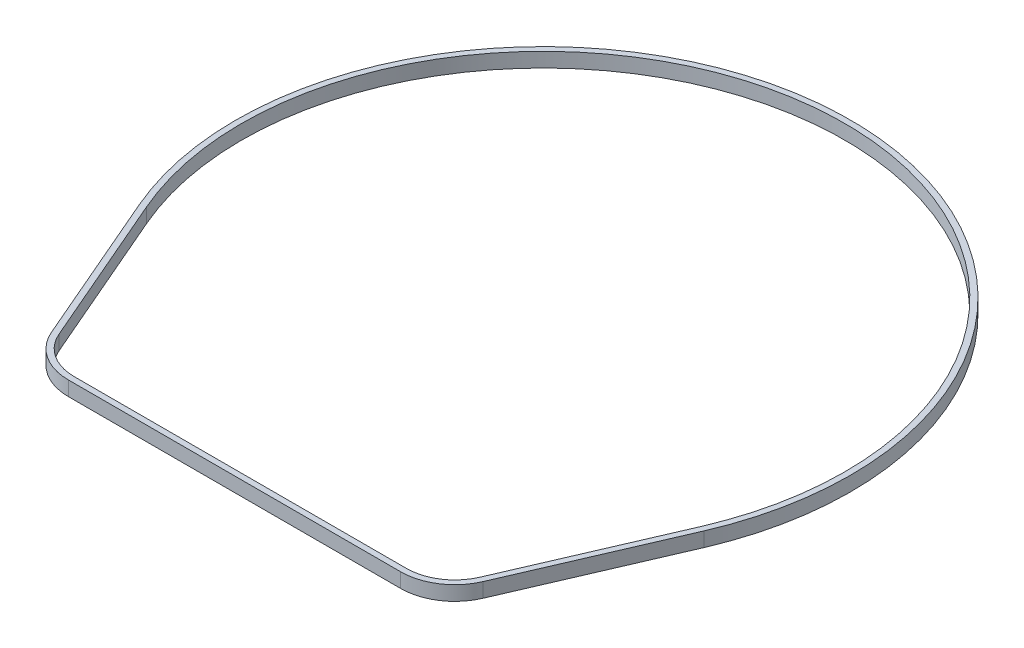
ISO-10303-21;
HEADER;
FILE_DESCRIPTION(('STEP AP214'),'2;1');
FILE_NAME('part.step','',(''),(''),'','','');
FILE_SCHEMA(('AUTOMOTIVE_DESIGN { 1 0 10303 214 1 1 1 1 }'));
ENDSEC;
DATA;
#1=APPLICATION_CONTEXT('core data for automotive mechanical design processes');
#2=APPLICATION_PROTOCOL_DEFINITION('international standard','automotive_design',2000,#1);
#3=PRODUCT_CONTEXT('',#1,'mechanical');
#4=PRODUCT('Part','Part','',(#3));
#5=PRODUCT_RELATED_PRODUCT_CATEGORY('part','',(#4));
#6=PRODUCT_DEFINITION_FORMATION('','',#4);
#7=PRODUCT_DEFINITION_CONTEXT('part definition',#1,'design');
#8=PRODUCT_DEFINITION('design','',#6,#7);
#9=PRODUCT_DEFINITION_SHAPE('','',#8);
#10=(LENGTH_UNIT() NAMED_UNIT(*) SI_UNIT(.MILLI.,.METRE.));
#11=(NAMED_UNIT(*) PLANE_ANGLE_UNIT() SI_UNIT($,.RADIAN.));
#12=(NAMED_UNIT(*) SI_UNIT($,.STERADIAN.) SOLID_ANGLE_UNIT());
#13=UNCERTAINTY_MEASURE_WITH_UNIT(LENGTH_MEASURE(1.E-05),#10,'distance_accuracy_value','');
#14=(GEOMETRIC_REPRESENTATION_CONTEXT(3) GLOBAL_UNCERTAINTY_ASSIGNED_CONTEXT((#13)) GLOBAL_UNIT_ASSIGNED_CONTEXT((#10,
#11,#12)) REPRESENTATION_CONTEXT('',''));
#15=CARTESIAN_POINT('',(0.,0.,0.));
#16=DIRECTION('',(0.,0.,1.));
#17=DIRECTION('',(1.,0.,0.));
#18=AXIS2_PLACEMENT_3D('',#15,#16,#17);
#19=CARTESIAN_POINT('',(58.4908938392196,3.,25.2290574118247));
#20=DIRECTION('',(-0.91822439308037,0.,-0.396060555915615));
#21=DIRECTION('',(-0.396060555915615,0.,0.91822439308037));
#22=AXIS2_PLACEMENT_3D('',#19,#20,#21);
#23=PLANE('',#22);
#24=DIRECTION('',(0.396060555915615,0.,-0.91822439308037));
#25=VECTOR('',#24,1.);
#26=CARTESIAN_POINT('',(58.4908938392196,0.,25.2290574118247));
#27=LINE('',#26,#25);
#28=CARTESIAN_POINT('',(44.7068598792863,0.,57.1858782262549));
#29=VERTEX_POINT('',#28);
#30=CARTESIAN_POINT('',(58.4908938392195,0.,25.2290574118249));
#31=VERTEX_POINT('',#30);
#32=EDGE_CURVE('E176',#29,#31,#27,.T.);
#33=ORIENTED_EDGE('',*,*,#32,.T.);
#34=DIRECTION('',(0.,-1.,0.));
#35=VECTOR('',#34,1.);
#36=CARTESIAN_POINT('',(58.4908938392195,3.,25.2290574118249));
#37=LINE('',#36,#35);
#38=CARTESIAN_POINT('',(58.4908938392195,3.,25.2290574118249));
#39=VERTEX_POINT('',#38);
#40=EDGE_CURVE('E11',#39,#31,#37,.T.);
#41=ORIENTED_EDGE('',*,*,#40,.F.);
#42=DIRECTION('',(0.396060555915615,0.,-0.91822439308037));
#43=VECTOR('',#42,1.);
#44=CARTESIAN_POINT('',(58.4908938392196,3.,25.2290574118247));
#45=LINE('',#44,#43);
#46=CARTESIAN_POINT('',(44.7068598792863,3.,57.1858782262549));
#47=VERTEX_POINT('',#46);
#48=EDGE_CURVE('E355',#47,#39,#45,.T.);
#49=ORIENTED_EDGE('',*,*,#48,.F.);
#50=DIRECTION('',(0.,-1.,0.));
#51=VECTOR('',#50,1.);
#52=CARTESIAN_POINT('',(44.7068598792863,3.,57.1858782262549));
#53=LINE('',#52,#51);
#54=EDGE_CURVE('E189',#47,#29,#53,.T.);
#55=ORIENTED_EDGE('',*,*,#54,.T.);
#56=EDGE_LOOP('',(#33,#41,#49,#55));
#57=FACE_BOUND('',#56,.T.);
#58=ADVANCED_FACE('F35',(#57),#23,.F.);
#59=CARTESIAN_POINT('',(0.,3.,0.));
#60=DIRECTION('',(0.,-1.,0.));
#61=DIRECTION('',(0.,0.,-1.));
#62=AXIS2_PLACEMENT_3D('',#59,#60,#61);
#63=CYLINDRICAL_SURFACE('',#62,63.7);
#64=CARTESIAN_POINT('',(0.,0.,0.));
#65=DIRECTION('',(0.,1.,0.));
#66=DIRECTION('',(0.,0.,1.));
#67=AXIS2_PLACEMENT_3D('',#64,#65,#66);
#68=CIRCLE('',#67,63.7);
#69=CARTESIAN_POINT('',(-58.4908938392195,0.,25.2290574118249));
#70=VERTEX_POINT('',#69);
#71=EDGE_CURVE('E179',#31,#70,#68,.T.);
#72=ORIENTED_EDGE('',*,*,#71,.T.);
#73=DIRECTION('',(0.,-1.,0.));
#74=VECTOR('',#73,1.);
#75=CARTESIAN_POINT('',(-58.4908938392195,3.,25.2290574118249));
#76=LINE('',#75,#74);
#77=CARTESIAN_POINT('',(-58.4908938392195,3.,25.2290574118249));
#78=VERTEX_POINT('',#77);
#79=EDGE_CURVE('E45',#78,#70,#76,.T.);
#80=ORIENTED_EDGE('',*,*,#79,.F.);
#81=CARTESIAN_POINT('',(0.,3.,0.));
#82=DIRECTION('',(0.,1.,0.));
#83=DIRECTION('',(0.,0.,1.));
#84=AXIS2_PLACEMENT_3D('',#81,#82,#83);
#85=CIRCLE('',#84,63.7);
#86=EDGE_CURVE('E356',#39,#78,#85,.T.);
#87=ORIENTED_EDGE('',*,*,#86,.F.);
#88=ORIENTED_EDGE('',*,*,#40,.T.);
#89=EDGE_LOOP('',(#72,#80,#87,#88));
#90=FACE_BOUND('',#89,.T.);
#91=ADVANCED_FACE('F241',(#90),#63,.T.);
#92=CARTESIAN_POINT('',(-58.4908938392196,3.,25.2290574118247));
#93=DIRECTION('',(-0.91822439308037,0.,0.396060555915615));
#94=DIRECTION('',(0.396060555915615,0.,0.91822439308037));
#95=AXIS2_PLACEMENT_3D('',#92,#93,#94);
#96=PLANE('',#95);
#97=DIRECTION('',(-0.396060555915615,0.,-0.91822439308037));
#98=VECTOR('',#97,1.);
#99=CARTESIAN_POINT('',(-58.4908938392196,0.,25.2290574118247));
#100=LINE('',#99,#98);
#101=CARTESIAN_POINT('',(-44.7068598792863,0.,57.1858782262549));
#102=VERTEX_POINT('',#101);
#103=EDGE_CURVE('E182',#102,#70,#100,.T.);
#104=ORIENTED_EDGE('',*,*,#103,.F.);
#105=DIRECTION('',(0.,-1.,0.));
#106=VECTOR('',#105,1.);
#107=CARTESIAN_POINT('',(-44.7068598792863,3.,57.1858782262549));
#108=LINE('',#107,#106);
#109=CARTESIAN_POINT('',(-44.7068598792863,3.,57.1858782262549));
#110=VERTEX_POINT('',#109);
#111=EDGE_CURVE('E149',#110,#102,#108,.T.);
#112=ORIENTED_EDGE('',*,*,#111,.F.);
#113=DIRECTION('',(-0.396060555915615,0.,-0.91822439308037));
#114=VECTOR('',#113,1.);
#115=CARTESIAN_POINT('',(-58.4908938392196,3.,25.2290574118247));
#116=LINE('',#115,#114);
#117=EDGE_CURVE('E142',#110,#78,#116,.T.);
#118=ORIENTED_EDGE('',*,*,#117,.T.);
#119=ORIENTED_EDGE('',*,*,#79,.T.);
#120=EDGE_LOOP('',(#104,#112,#118,#119));
#121=FACE_BOUND('',#120,.T.);
#122=ADVANCED_FACE('F247',(#121),#96,.T.);
#123=CARTESIAN_POINT('',(-34.4227466767862,3.,52.75));
#124=DIRECTION('',(0.,-1.,0.));
#125=DIRECTION('',(0.,0.,-1.));
#126=AXIS2_PLACEMENT_3D('',#123,#124,#125);
#127=CYLINDRICAL_SURFACE('',#126,11.2);
#128=CARTESIAN_POINT('',(-34.4227466767862,0.,52.75));
#129=DIRECTION('',(0.,1.,0.));
#130=DIRECTION('',(0.,0.,1.));
#131=AXIS2_PLACEMENT_3D('',#128,#129,#130);
#132=CIRCLE('',#131,11.2);
#133=CARTESIAN_POINT('',(-34.4227466767862,0.,63.95));
#134=VERTEX_POINT('',#133);
#135=EDGE_CURVE('E148',#102,#134,#132,.T.);
#136=ORIENTED_EDGE('',*,*,#135,.T.);
#137=DIRECTION('',(0.,-1.,0.));
#138=VECTOR('',#137,1.);
#139=CARTESIAN_POINT('',(-34.4227466767862,3.,63.95));
#140=LINE('',#139,#138);
#141=CARTESIAN_POINT('',(-34.4227466767862,3.,63.95));
#142=VERTEX_POINT('',#141);
#143=EDGE_CURVE('E145',#142,#134,#140,.T.);
#144=ORIENTED_EDGE('',*,*,#143,.F.);
#145=CARTESIAN_POINT('',(-34.4227466767862,3.,52.75));
#146=DIRECTION('',(0.,1.,0.));
#147=DIRECTION('',(0.,0.,1.));
#148=AXIS2_PLACEMENT_3D('',#145,#146,#147);
#149=CIRCLE('',#148,11.2);
#150=EDGE_CURVE('E136',#110,#142,#149,.T.);
#151=ORIENTED_EDGE('',*,*,#150,.F.);
#152=ORIENTED_EDGE('',*,*,#111,.T.);
#153=EDGE_LOOP('',(#136,#144,#151,#152));
#154=FACE_BOUND('',#153,.T.);
#155=ADVANCED_FACE('F146',(#154),#127,.T.);
#156=CARTESIAN_POINT('',(0.,3.,63.95));
#157=DIRECTION('',(0.,0.,-1.));
#158=DIRECTION('',(-1.,0.,0.));
#159=AXIS2_PLACEMENT_3D('',#156,#157,#158);
#160=PLANE('',#159);
#161=DIRECTION('',(1.,0.,0.));
#162=VECTOR('',#161,1.);
#163=CARTESIAN_POINT('',(0.,0.,63.95));
#164=LINE('',#163,#162);
#165=CARTESIAN_POINT('',(34.4227466767862,0.,63.95));
#166=VERTEX_POINT('',#165);
#167=EDGE_CURVE('E95',#134,#166,#164,.T.);
#168=ORIENTED_EDGE('',*,*,#167,.T.);
#169=DIRECTION('',(0.,-1.,0.));
#170=VECTOR('',#169,1.);
#171=CARTESIAN_POINT('',(34.4227466767862,3.,63.95));
#172=LINE('',#171,#170);
#173=CARTESIAN_POINT('',(34.4227466767862,3.,63.95));
#174=VERTEX_POINT('',#173);
#175=EDGE_CURVE('E150',#174,#166,#172,.T.);
#176=ORIENTED_EDGE('',*,*,#175,.F.);
#177=DIRECTION('',(1.,0.,0.));
#178=VECTOR('',#177,1.);
#179=CARTESIAN_POINT('',(0.,3.,63.95));
#180=LINE('',#179,#178);
#181=EDGE_CURVE('E140',#142,#174,#180,.T.);
#182=ORIENTED_EDGE('',*,*,#181,.F.);
#183=ORIENTED_EDGE('',*,*,#143,.T.);
#184=EDGE_LOOP('',(#168,#176,#182,#183));
#185=FACE_BOUND('',#184,.T.);
#186=ADVANCED_FACE('F152',(#185),#160,.F.);
#187=CARTESIAN_POINT('',(-34.4227466767862,3.,52.75));
#188=DIRECTION('',(0.,-1.,0.));
#189=DIRECTION('',(0.,0.,-1.));
#190=AXIS2_PLACEMENT_3D('',#187,#188,#189);
#191=CYLINDRICAL_SURFACE('',#190,10.);
#192=CARTESIAN_POINT('',(-34.4227466767862,0.,52.75));
#193=DIRECTION('',(0.,1.,0.));
#194=DIRECTION('',(0.,0.,1.));
#195=AXIS2_PLACEMENT_3D('',#192,#193,#194);
#196=CIRCLE('',#195,10.);
#197=CARTESIAN_POINT('',(-43.6049906075899,0.,56.7106055591561));
#198=VERTEX_POINT('',#197);
#199=CARTESIAN_POINT('',(-34.4227466767862,0.,62.75));
#200=VERTEX_POINT('',#199);
#201=EDGE_CURVE('E158',#198,#200,#196,.T.);
#202=ORIENTED_EDGE('',*,*,#201,.F.);
#203=DIRECTION('',(0.,-1.,0.));
#204=VECTOR('',#203,1.);
#205=CARTESIAN_POINT('',(-43.6049906075899,3.,56.7106055591561));
#206=LINE('',#205,#204);
#207=CARTESIAN_POINT('',(-43.6049906075899,3.,56.7106055591561));
#208=VERTEX_POINT('',#207);
#209=EDGE_CURVE('E39',#208,#198,#206,.T.);
#210=ORIENTED_EDGE('',*,*,#209,.F.);
#211=CARTESIAN_POINT('',(-34.4227466767862,3.,52.75));
#212=DIRECTION('',(0.,1.,0.));
#213=DIRECTION('',(0.,0.,1.));
#214=AXIS2_PLACEMENT_3D('',#211,#212,#213);
#215=CIRCLE('',#214,10.);
#216=CARTESIAN_POINT('',(-34.4227466767862,3.,62.75));
#217=VERTEX_POINT('',#216);
#218=EDGE_CURVE('E188',#208,#217,#215,.T.);
#219=ORIENTED_EDGE('',*,*,#218,.T.);
#220=DIRECTION('',(0.,-1.,0.));
#221=VECTOR('',#220,1.);
#222=CARTESIAN_POINT('',(-34.4227466767862,3.,62.75));
#223=LINE('',#222,#221);
#224=EDGE_CURVE('E154',#217,#200,#223,.T.);
#225=ORIENTED_EDGE('',*,*,#224,.T.);
#226=EDGE_LOOP('',(#202,#210,#219,#225));
#227=FACE_BOUND('',#226,.T.);
#228=ADVANCED_FACE('F37',(#227),#191,.F.);
#229=CARTESIAN_POINT('',(-57.3890245675231,3.,24.7537847447259));
#230=DIRECTION('',(-0.91822439308037,0.,0.396060555915615));
#231=DIRECTION('',(0.396060555915615,0.,0.91822439308037));
#232=AXIS2_PLACEMENT_3D('',#229,#230,#231);
#233=PLANE('',#232);
#234=DIRECTION('',(-0.396060555915615,0.,-0.91822439308037));
#235=VECTOR('',#234,1.);
#236=CARTESIAN_POINT('',(-57.3890245675231,0.,24.7537847447259));
#237=LINE('',#236,#235);
#238=CARTESIAN_POINT('',(-57.3890245675231,0.,24.7537847447261));
#239=VERTEX_POINT('',#238);
#240=EDGE_CURVE('E161',#198,#239,#237,.T.);
#241=ORIENTED_EDGE('',*,*,#240,.T.);
#242=DIRECTION('',(0.,-1.,0.));
#243=VECTOR('',#242,1.);
#244=CARTESIAN_POINT('',(-57.3890245675231,3.,24.7537847447261));
#245=LINE('',#244,#243);
#246=CARTESIAN_POINT('',(-57.3890245675231,3.,24.7537847447261));
#247=VERTEX_POINT('',#246);
#248=EDGE_CURVE('E200',#247,#239,#245,.T.);
#249=ORIENTED_EDGE('',*,*,#248,.F.);
#250=DIRECTION('',(-0.396060555915615,0.,-0.91822439308037));
#251=VECTOR('',#250,1.);
#252=CARTESIAN_POINT('',(-57.3890245675231,3.,24.7537847447259));
#253=LINE('',#252,#251);
#254=EDGE_CURVE('E208',#208,#247,#253,.T.);
#255=ORIENTED_EDGE('',*,*,#254,.F.);
#256=ORIENTED_EDGE('',*,*,#209,.T.);
#257=EDGE_LOOP('',(#241,#249,#255,#256));
#258=FACE_BOUND('',#257,.T.);
#259=ADVANCED_FACE('F207',(#258),#233,.F.);
#260=CARTESIAN_POINT('',(0.,3.,0.));
#261=DIRECTION('',(0.,-1.,0.));
#262=DIRECTION('',(0.,0.,-1.));
#263=AXIS2_PLACEMENT_3D('',#260,#261,#262);
#264=CYLINDRICAL_SURFACE('',#263,62.5);
#265=CARTESIAN_POINT('',(0.,0.,0.));
#266=DIRECTION('',(0.,1.,0.));
#267=DIRECTION('',(0.,0.,1.));
#268=AXIS2_PLACEMENT_3D('',#265,#266,#267);
#269=CIRCLE('',#268,62.5);
#270=CARTESIAN_POINT('',(57.3890245675231,0.,24.7537847447261));
#271=VERTEX_POINT('',#270);
#272=EDGE_CURVE('E164',#271,#239,#269,.T.);
#273=ORIENTED_EDGE('',*,*,#272,.F.);
#274=DIRECTION('',(0.,-1.,0.));
#275=VECTOR('',#274,1.);
#276=CARTESIAN_POINT('',(57.3890245675231,3.,24.7537847447261));
#277=LINE('',#276,#275);
#278=CARTESIAN_POINT('',(57.3890245675231,3.,24.7537847447261));
#279=VERTEX_POINT('',#278);
#280=EDGE_CURVE('E199',#279,#271,#277,.T.);
#281=ORIENTED_EDGE('',*,*,#280,.F.);
#282=CARTESIAN_POINT('',(0.,3.,0.));
#283=DIRECTION('',(0.,1.,0.));
#284=DIRECTION('',(0.,0.,1.));
#285=AXIS2_PLACEMENT_3D('',#282,#283,#284);
#286=CIRCLE('',#285,62.5);
#287=EDGE_CURVE('E363',#279,#247,#286,.T.);
#288=ORIENTED_EDGE('',*,*,#287,.T.);
#289=ORIENTED_EDGE('',*,*,#248,.T.);
#290=EDGE_LOOP('',(#273,#281,#288,#289));
#291=FACE_BOUND('',#290,.T.);
#292=ADVANCED_FACE('F232',(#291),#264,.F.);
#293=CARTESIAN_POINT('',(57.3890245675231,3.,24.7537847447259));
#294=DIRECTION('',(-0.91822439308037,0.,-0.396060555915615));
#295=DIRECTION('',(-0.396060555915615,0.,0.91822439308037));
#296=AXIS2_PLACEMENT_3D('',#293,#294,#295);
#297=PLANE('',#296);
#298=DIRECTION('',(0.396060555915615,0.,-0.91822439308037));
#299=VECTOR('',#298,1.);
#300=CARTESIAN_POINT('',(57.3890245675231,0.,24.7537847447259));
#301=LINE('',#300,#299);
#302=CARTESIAN_POINT('',(43.6049906075899,0.,56.7106055591561));
#303=VERTEX_POINT('',#302);
#304=EDGE_CURVE('E167',#303,#271,#301,.T.);
#305=ORIENTED_EDGE('',*,*,#304,.F.);
#306=DIRECTION('',(0.,-1.,0.));
#307=VECTOR('',#306,1.);
#308=CARTESIAN_POINT('',(43.6049906075899,3.,56.7106055591561));
#309=LINE('',#308,#307);
#310=CARTESIAN_POINT('',(43.6049906075899,3.,56.7106055591561));
#311=VERTEX_POINT('',#310);
#312=EDGE_CURVE('E197',#311,#303,#309,.T.);
#313=ORIENTED_EDGE('',*,*,#312,.F.);
#314=DIRECTION('',(0.396060555915615,0.,-0.91822439308037));
#315=VECTOR('',#314,1.);
#316=CARTESIAN_POINT('',(57.3890245675231,3.,24.7537847447259));
#317=LINE('',#316,#315);
#318=EDGE_CURVE('E230',#311,#279,#317,.T.);
#319=ORIENTED_EDGE('',*,*,#318,.T.);
#320=ORIENTED_EDGE('',*,*,#280,.T.);
#321=EDGE_LOOP('',(#305,#313,#319,#320));
#322=FACE_BOUND('',#321,.T.);
#323=ADVANCED_FACE('F229',(#322),#297,.T.);
#324=CARTESIAN_POINT('',(34.4227466767862,3.,52.75));
#325=DIRECTION('',(0.,-1.,0.));
#326=DIRECTION('',(0.,0.,-1.));
#327=AXIS2_PLACEMENT_3D('',#324,#325,#326);
#328=CYLINDRICAL_SURFACE('',#327,10.);
#329=CARTESIAN_POINT('',(34.4227466767862,0.,52.75));
#330=DIRECTION('',(0.,1.,0.));
#331=DIRECTION('',(0.,0.,1.));
#332=AXIS2_PLACEMENT_3D('',#329,#330,#331);
#333=CIRCLE('',#332,10.);
#334=CARTESIAN_POINT('',(34.4227466767862,0.,62.75));
#335=VERTEX_POINT('',#334);
#336=EDGE_CURVE('E170',#335,#303,#333,.T.);
#337=ORIENTED_EDGE('',*,*,#336,.F.);
#338=DIRECTION('',(0.,-1.,0.));
#339=VECTOR('',#338,1.);
#340=CARTESIAN_POINT('',(34.4227466767862,3.,62.75));
#341=LINE('',#340,#339);
#342=CARTESIAN_POINT('',(34.4227466767862,3.,62.75));
#343=VERTEX_POINT('',#342);
#344=EDGE_CURVE('E195',#343,#335,#341,.T.);
#345=ORIENTED_EDGE('',*,*,#344,.F.);
#346=CARTESIAN_POINT('',(34.4227466767862,3.,52.75));
#347=DIRECTION('',(0.,1.,0.));
#348=DIRECTION('',(0.,0.,1.));
#349=AXIS2_PLACEMENT_3D('',#346,#347,#348);
#350=CIRCLE('',#349,10.);
#351=EDGE_CURVE('E225',#343,#311,#350,.T.);
#352=ORIENTED_EDGE('',*,*,#351,.T.);
#353=ORIENTED_EDGE('',*,*,#312,.T.);
#354=EDGE_LOOP('',(#337,#345,#352,#353));
#355=FACE_BOUND('',#354,.T.);
#356=ADVANCED_FACE('F222',(#355),#328,.F.);
#357=CARTESIAN_POINT('',(0.,3.,62.75));
#358=DIRECTION('',(0.,0.,-1.));
#359=DIRECTION('',(-1.,0.,0.));
#360=AXIS2_PLACEMENT_3D('',#357,#358,#359);
#361=PLANE('',#360);
#362=DIRECTION('',(1.,0.,0.));
#363=VECTOR('',#362,1.);
#364=CARTESIAN_POINT('',(0.,0.,62.75));
#365=LINE('',#364,#363);
#366=EDGE_CURVE('E173',#200,#335,#365,.T.);
#367=ORIENTED_EDGE('',*,*,#366,.F.);
#368=ORIENTED_EDGE('',*,*,#224,.F.);
#369=DIRECTION('',(1.,0.,0.));
#370=VECTOR('',#369,1.);
#371=CARTESIAN_POINT('',(0.,3.,62.75));
#372=LINE('',#371,#370);
#373=EDGE_CURVE('E218',#217,#343,#372,.T.);
#374=ORIENTED_EDGE('',*,*,#373,.T.);
#375=ORIENTED_EDGE('',*,*,#344,.T.);
#376=EDGE_LOOP('',(#367,#368,#374,#375));
#377=FACE_BOUND('',#376,.T.);
#378=ADVANCED_FACE('F217',(#377),#361,.T.);
#379=CARTESIAN_POINT('',(34.4227466767862,3.,52.75));
#380=DIRECTION('',(0.,-1.,0.));
#381=DIRECTION('',(0.,0.,-1.));
#382=AXIS2_PLACEMENT_3D('',#379,#380,#381);
#383=CYLINDRICAL_SURFACE('',#382,11.2);
#384=CARTESIAN_POINT('',(34.4227466767862,0.,52.75));
#385=DIRECTION('',(0.,1.,0.));
#386=DIRECTION('',(0.,0.,1.));
#387=AXIS2_PLACEMENT_3D('',#384,#385,#386);
#388=CIRCLE('',#387,11.2);
#389=EDGE_CURVE('E101',#166,#29,#388,.T.);
#390=ORIENTED_EDGE('',*,*,#389,.T.);
#391=ORIENTED_EDGE('',*,*,#54,.F.);
#392=CARTESIAN_POINT('',(34.4227466767862,3.,52.75));
#393=DIRECTION('',(0.,1.,0.));
#394=DIRECTION('',(0.,0.,1.));
#395=AXIS2_PLACEMENT_3D('',#392,#393,#394);
#396=CIRCLE('',#395,11.2);
#397=EDGE_CURVE('E54',#174,#47,#396,.T.);
#398=ORIENTED_EDGE('',*,*,#397,.F.);
#399=ORIENTED_EDGE('',*,*,#175,.T.);
#400=EDGE_LOOP('',(#390,#391,#398,#399));
#401=FACE_BOUND('',#400,.T.);
#402=ADVANCED_FACE('F254',(#401),#383,.T.);
#403=CARTESIAN_POINT('',(0.,3.,0.));
#404=DIRECTION('',(0.,1.,0.));
#405=DIRECTION('',(0.,0.,1.));
#406=AXIS2_PLACEMENT_3D('',#403,#404,#405);
#407=PLANE('',#406);
#408=ORIENTED_EDGE('',*,*,#218,.F.);
#409=ORIENTED_EDGE('',*,*,#254,.T.);
#410=ORIENTED_EDGE('',*,*,#287,.F.);
#411=ORIENTED_EDGE('',*,*,#318,.F.);
#412=ORIENTED_EDGE('',*,*,#351,.F.);
#413=ORIENTED_EDGE('',*,*,#373,.F.);
#414=EDGE_LOOP('',(#408,#409,#410,#411,#412,#413));
#415=FACE_BOUND('',#414,.T.);
#416=ORIENTED_EDGE('',*,*,#48,.T.);
#417=ORIENTED_EDGE('',*,*,#86,.T.);
#418=ORIENTED_EDGE('',*,*,#117,.F.);
#419=ORIENTED_EDGE('',*,*,#150,.T.);
#420=ORIENTED_EDGE('',*,*,#181,.T.);
#421=ORIENTED_EDGE('',*,*,#397,.T.);
#422=EDGE_LOOP('',(#416,#417,#418,#419,#420,#421));
#423=FACE_BOUND('',#422,.T.);
#424=ADVANCED_FACE('F138',(#415,#423),#407,.T.);
#425=CARTESIAN_POINT('',(0.,0.,0.));
#426=DIRECTION('',(0.,1.,0.));
#427=DIRECTION('',(0.,0.,1.));
#428=AXIS2_PLACEMENT_3D('',#425,#426,#427);
#429=PLANE('',#428);
#430=ORIENTED_EDGE('',*,*,#201,.T.);
#431=ORIENTED_EDGE('',*,*,#366,.T.);
#432=ORIENTED_EDGE('',*,*,#336,.T.);
#433=ORIENTED_EDGE('',*,*,#304,.T.);
#434=ORIENTED_EDGE('',*,*,#272,.T.);
#435=ORIENTED_EDGE('',*,*,#240,.F.);
#436=EDGE_LOOP('',(#430,#431,#432,#433,#434,#435));
#437=FACE_BOUND('',#436,.T.);
#438=ORIENTED_EDGE('',*,*,#32,.F.);
#439=ORIENTED_EDGE('',*,*,#389,.F.);
#440=ORIENTED_EDGE('',*,*,#167,.F.);
#441=ORIENTED_EDGE('',*,*,#135,.F.);
#442=ORIENTED_EDGE('',*,*,#103,.T.);
#443=ORIENTED_EDGE('',*,*,#71,.F.);
#444=EDGE_LOOP('',(#438,#439,#440,#441,#442,#443));
#445=FACE_BOUND('',#444,.T.);
#446=ADVANCED_FACE('F211',(#437,#445),#429,.F.);
#447=CLOSED_SHELL('',(#58,#91,#122,#155,#186,#228,#259,#292,#323,#356,#378,#402,#424,#446));
#448=MANIFOLD_SOLID_BREP('B2',#447);
#449=ADVANCED_BREP_SHAPE_REPRESENTATION('',(#18,#448),#14);
#450=SHAPE_DEFINITION_REPRESENTATION(#9,#449);
ENDSEC;
END-ISO-10303-21;
